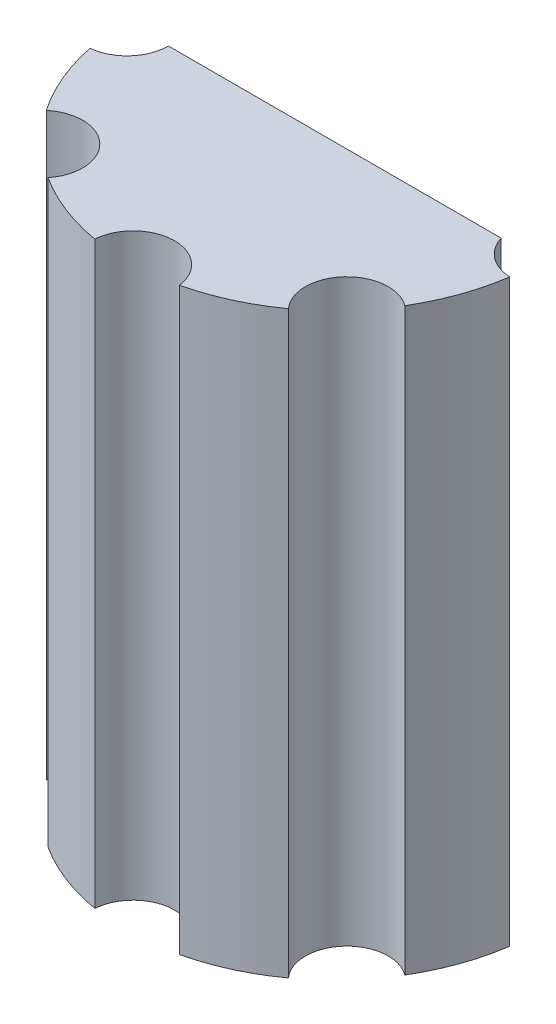
ISO-10303-21;
HEADER;
FILE_DESCRIPTION(('STEP AP214'),'2;1');
FILE_NAME('part.step','',(''),(''),'','','');
FILE_SCHEMA(('AUTOMOTIVE_DESIGN { 1 0 10303 214 1 1 1 1 }'));
ENDSEC;
DATA;
#1=APPLICATION_CONTEXT('core data for automotive mechanical design processes');
#2=APPLICATION_PROTOCOL_DEFINITION('international standard','automotive_design',2000,#1);
#3=PRODUCT_CONTEXT('',#1,'mechanical');
#4=PRODUCT('Part','Part','',(#3));
#5=PRODUCT_RELATED_PRODUCT_CATEGORY('part','',(#4));
#6=PRODUCT_DEFINITION_FORMATION('','',#4);
#7=PRODUCT_DEFINITION_CONTEXT('part definition',#1,'design');
#8=PRODUCT_DEFINITION('design','',#6,#7);
#9=PRODUCT_DEFINITION_SHAPE('','',#8);
#10=(LENGTH_UNIT() NAMED_UNIT(*) SI_UNIT(.MILLI.,.METRE.));
#11=(NAMED_UNIT(*) PLANE_ANGLE_UNIT() SI_UNIT($,.RADIAN.));
#12=(NAMED_UNIT(*) SI_UNIT($,.STERADIAN.) SOLID_ANGLE_UNIT());
#13=UNCERTAINTY_MEASURE_WITH_UNIT(LENGTH_MEASURE(1.E-05),#10,'distance_accuracy_value','');
#14=(GEOMETRIC_REPRESENTATION_CONTEXT(3) GLOBAL_UNCERTAINTY_ASSIGNED_CONTEXT((#13)) GLOBAL_UNIT_ASSIGNED_CONTEXT((#10,
#11,#12)) REPRESENTATION_CONTEXT('',''));
#15=CARTESIAN_POINT('',(0.,0.,0.));
#16=DIRECTION('',(0.,0.,1.));
#17=DIRECTION('',(1.,0.,0.));
#18=AXIS2_PLACEMENT_3D('',#15,#16,#17);
#19=CARTESIAN_POINT('',(0.,7.,0.));
#20=DIRECTION('',(0.,-1.,0.));
#21=DIRECTION('',(0.,0.,-1.));
#22=AXIS2_PLACEMENT_3D('',#19,#20,#21);
#23=CYLINDRICAL_SURFACE('',#22,2.5);
#24=DIRECTION('',(0.,-1.,0.));
#25=VECTOR('',#24,1.);
#26=CARTESIAN_POINT('',(2.4748629703783,3.5,0.353628728824886));
#27=LINE('',#26,#25);
#28=CARTESIAN_POINT('',(2.4748629703783,7.,0.353628728824886));
#29=VERTEX_POINT('',#28);
#30=CARTESIAN_POINT('',(2.4748629703783,0.,0.353628728824886));
#31=VERTEX_POINT('',#30);
#32=EDGE_CURVE('E105',#29,#31,#27,.T.);
#33=ORIENTED_EDGE('',*,*,#32,.F.);
#34=CARTESIAN_POINT('',(0.,7.,0.));
#35=DIRECTION('',(0.,1.,0.));
#36=DIRECTION('',(0.,0.,1.));
#37=AXIS2_PLACEMENT_3D('',#34,#35,#36);
#38=CIRCLE('',#37,2.5);
#39=CARTESIAN_POINT('',(2.1426532925143,7.,1.28803605076785));
#40=VERTEX_POINT('',#39);
#41=EDGE_CURVE('E139',#40,#29,#38,.T.);
#42=ORIENTED_EDGE('',*,*,#41,.F.);
#43=DIRECTION('',(0.,-1.,0.));
#44=VECTOR('',#43,1.);
#45=CARTESIAN_POINT('',(2.1426532925143,3.5,1.28803605076785));
#46=LINE('',#45,#44);
#47=CARTESIAN_POINT('',(2.1426532925143,0.,1.28803605076785));
#48=VERTEX_POINT('',#47);
#49=EDGE_CURVE('E124',#48,#40,#46,.F.);
#50=ORIENTED_EDGE('',*,*,#49,.F.);
#51=CARTESIAN_POINT('',(0.,0.,0.));
#52=DIRECTION('',(0.,1.,0.));
#53=DIRECTION('',(0.,0.,1.));
#54=AXIS2_PLACEMENT_3D('',#51,#52,#53);
#55=CIRCLE('',#54,2.5);
#56=EDGE_CURVE('E119',#48,#31,#55,.T.);
#57=ORIENTED_EDGE('',*,*,#56,.T.);
#58=EDGE_LOOP('',(#33,#42,#50,#57));
#59=FACE_BOUND('',#58,.T.);
#60=ADVANCED_FACE('F31',(#59),#23,.T.);
#61=CARTESIAN_POINT('',(0.,7.,0.));
#62=DIRECTION('',(0.,1.,0.));
#63=DIRECTION('',(0.,0.,1.));
#64=AXIS2_PLACEMENT_3D('',#61,#62,#63);
#65=PLANE('',#64);
#66=ORIENTED_EDGE('',*,*,#41,.T.);
#67=CARTESIAN_POINT('',(2.49573693948688,7.,-0.145935358568967));
#68=DIRECTION('',(0.,1.,0.));
#69=DIRECTION('',(0.,0.,1.));
#70=AXIS2_PLACEMENT_3D('',#67,#68,#69);
#71=CIRCLE('',#70,0.499999999999999);
#72=CARTESIAN_POINT('',(2.01750804960323,7.,0.));
#73=VERTEX_POINT('',#72);
#74=EDGE_CURVE('E108',#73,#29,#71,.T.);
#75=ORIENTED_EDGE('',*,*,#74,.F.);
#76=DIRECTION('',(-1.,0.,0.));
#77=VECTOR('',#76,1.);
#78=CARTESIAN_POINT('',(-2.5,7.,0.));
#79=LINE('',#78,#77);
#80=CARTESIAN_POINT('',(-2.,7.,0.));
#81=VERTEX_POINT('',#80);
#82=EDGE_CURVE('E39',#73,#81,#79,.T.);
#83=ORIENTED_EDGE('',*,*,#82,.T.);
#84=CARTESIAN_POINT('',(-2.5,7.,0.));
#85=DIRECTION('',(0.,1.,0.));
#86=DIRECTION('',(0.,0.,1.));
#87=AXIS2_PLACEMENT_3D('',#84,#85,#86);
#88=CIRCLE('',#87,0.499999999999999);
#89=CARTESIAN_POINT('',(-2.45,7.,0.497493718553309));
#90=VERTEX_POINT('',#89);
#91=EDGE_CURVE('E172',#90,#81,#88,.T.);
#92=ORIENTED_EDGE('',*,*,#91,.F.);
#93=CARTESIAN_POINT('',(-2.06381158708902,7.,1.41091521112967));
#94=VERTEX_POINT('',#93);
#95=EDGE_CURVE('E178',#90,#94,#38,.T.);
#96=ORIENTED_EDGE('',*,*,#95,.T.);
#97=CARTESIAN_POINT('',(-1.74176677336791,7.,1.79339022724881));
#98=DIRECTION('',(0.,1.,0.));
#99=DIRECTION('',(0.,0.,1.));
#100=AXIS2_PLACEMENT_3D('',#97,#98,#99);
#101=CIRCLE('',#100,0.5);
#102=CARTESIAN_POINT('',(-1.35005128871208,7.,2.10412963427799));
#103=VERTEX_POINT('',#102);
#104=EDGE_CURVE('E165',#103,#94,#101,.T.);
#105=ORIENTED_EDGE('',*,*,#104,.F.);
#106=CARTESIAN_POINT('',(-0.425742759106683,7.,2.46348190638134));
#107=VERTEX_POINT('',#106);
#108=EDGE_CURVE('E180',#103,#107,#38,.T.);
#109=ORIENTED_EDGE('',*,*,#108,.T.);
#110=CARTESIAN_POINT('',(0.0729988057532304,7.,2.49893400760376));
#111=DIRECTION('',(0.,1.,0.));
#112=DIRECTION('',(0.,0.,1.));
#113=AXIS2_PLACEMENT_3D('',#110,#111,#112);
#114=CIRCLE('',#113,0.5);
#115=CARTESIAN_POINT('',(0.568820418383014,7.,2.43442874852204));
#116=VERTEX_POINT('',#115);
#117=EDGE_CURVE('E157',#116,#107,#114,.T.);
#118=ORIENTED_EDGE('',*,*,#117,.F.);
#119=CARTESIAN_POINT('',(1.47057591363782,7.,2.02173353393277));
#120=VERTEX_POINT('',#119);
#121=EDGE_CURVE('E214',#116,#120,#38,.T.);
#122=ORIENTED_EDGE('',*,*,#121,.T.);
#123=CARTESIAN_POINT('',(1.84348428885312,7.,1.68865795137787));
#124=DIRECTION('',(0.,1.,0.));
#125=DIRECTION('',(0.,0.,1.));
#126=AXIS2_PLACEMENT_3D('',#123,#124,#125);
#127=CIRCLE('',#126,0.499999999999999);
#128=EDGE_CURVE('E218',#40,#120,#127,.T.);
#129=ORIENTED_EDGE('',*,*,#128,.F.);
#130=EDGE_LOOP('',(#66,#75,#83,#92,#96,#105,#109,#118,#122,#129));
#131=FACE_BOUND('',#130,.T.);
#132=ADVANCED_FACE('F184',(#131),#65,.T.);
#133=CARTESIAN_POINT('',(0.,0.,0.));
#134=DIRECTION('',(0.,1.,0.));
#135=DIRECTION('',(0.,0.,1.));
#136=AXIS2_PLACEMENT_3D('',#133,#134,#135);
#137=PLANE('',#136);
#138=CARTESIAN_POINT('',(2.49573693948688,0.,-0.145935358568967));
#139=DIRECTION('',(0.,1.,0.));
#140=DIRECTION('',(0.,0.,1.));
#141=AXIS2_PLACEMENT_3D('',#138,#139,#140);
#142=CIRCLE('',#141,0.499999999999999);
#143=CARTESIAN_POINT('',(2.01750804960323,0.,0.));
#144=VERTEX_POINT('',#143);
#145=EDGE_CURVE('E45',#144,#31,#142,.T.);
#146=ORIENTED_EDGE('',*,*,#145,.T.);
#147=ORIENTED_EDGE('',*,*,#56,.F.);
#148=CARTESIAN_POINT('',(1.84348428885312,0.,1.68865795137787));
#149=DIRECTION('',(0.,1.,0.));
#150=DIRECTION('',(0.,0.,1.));
#151=AXIS2_PLACEMENT_3D('',#148,#149,#150);
#152=CIRCLE('',#151,0.499999999999999);
#153=CARTESIAN_POINT('',(1.47057591363782,0.,2.02173353393277));
#154=VERTEX_POINT('',#153);
#155=EDGE_CURVE('E113',#48,#154,#152,.T.);
#156=ORIENTED_EDGE('',*,*,#155,.T.);
#157=CARTESIAN_POINT('',(0.568820418383014,0.,2.43442874852204));
#158=VERTEX_POINT('',#157);
#159=EDGE_CURVE('E125',#158,#154,#55,.T.);
#160=ORIENTED_EDGE('',*,*,#159,.F.);
#161=CARTESIAN_POINT('',(0.0729988057532304,0.,2.49893400760376));
#162=DIRECTION('',(0.,1.,0.));
#163=DIRECTION('',(0.,0.,1.));
#164=AXIS2_PLACEMENT_3D('',#161,#162,#163);
#165=CIRCLE('',#164,0.5);
#166=CARTESIAN_POINT('',(-0.425742759106683,0.,2.46348190638134));
#167=VERTEX_POINT('',#166);
#168=EDGE_CURVE('E154',#158,#167,#165,.T.);
#169=ORIENTED_EDGE('',*,*,#168,.T.);
#170=CARTESIAN_POINT('',(-1.35005128871208,0.,2.10412963427799));
#171=VERTEX_POINT('',#170);
#172=EDGE_CURVE('E130',#171,#167,#55,.T.);
#173=ORIENTED_EDGE('',*,*,#172,.F.);
#174=CARTESIAN_POINT('',(-1.74176677336791,0.,1.79339022724881));
#175=DIRECTION('',(0.,1.,0.));
#176=DIRECTION('',(0.,0.,1.));
#177=AXIS2_PLACEMENT_3D('',#174,#175,#176);
#178=CIRCLE('',#177,0.5);
#179=CARTESIAN_POINT('',(-2.06381158708902,0.,1.41091521112967));
#180=VERTEX_POINT('',#179);
#181=EDGE_CURVE('E152',#171,#180,#178,.T.);
#182=ORIENTED_EDGE('',*,*,#181,.T.);
#183=CARTESIAN_POINT('',(-2.45,0.,0.497493718553309));
#184=VERTEX_POINT('',#183);
#185=EDGE_CURVE('E128',#184,#180,#55,.T.);
#186=ORIENTED_EDGE('',*,*,#185,.F.);
#187=CARTESIAN_POINT('',(-2.5,0.,0.));
#188=DIRECTION('',(0.,1.,0.));
#189=DIRECTION('',(0.,0.,1.));
#190=AXIS2_PLACEMENT_3D('',#187,#188,#189);
#191=CIRCLE('',#190,0.499999999999999);
#192=CARTESIAN_POINT('',(-2.,0.,0.));
#193=VERTEX_POINT('',#192);
#194=EDGE_CURVE('E171',#184,#193,#191,.T.);
#195=ORIENTED_EDGE('',*,*,#194,.T.);
#196=DIRECTION('',(-1.,0.,0.));
#197=VECTOR('',#196,1.);
#198=CARTESIAN_POINT('',(-2.5,0.,0.));
#199=LINE('',#198,#197);
#200=EDGE_CURVE('E121',#144,#193,#199,.T.);
#201=ORIENTED_EDGE('',*,*,#200,.F.);
#202=EDGE_LOOP('',(#146,#147,#156,#160,#169,#173,#182,#186,#195,#201));
#203=FACE_BOUND('',#202,.T.);
#204=ADVANCED_FACE('F118',(#203),#137,.F.);
#205=CARTESIAN_POINT('',(-2.5,7.,0.));
#206=DIRECTION('',(0.,0.,1.));
#207=DIRECTION('',(1.,0.,0.));
#208=AXIS2_PLACEMENT_3D('',#205,#206,#207);
#209=PLANE('',#208);
#210=DIRECTION('',(0.,-1.,0.));
#211=VECTOR('',#210,1.);
#212=CARTESIAN_POINT('',(2.01750804960323,7.,0.));
#213=LINE('',#212,#211);
#214=EDGE_CURVE('E11',#144,#73,#213,.F.);
#215=ORIENTED_EDGE('',*,*,#214,.F.);
#216=ORIENTED_EDGE('',*,*,#200,.T.);
#217=DIRECTION('',(0.,-1.,0.));
#218=VECTOR('',#217,1.);
#219=CARTESIAN_POINT('',(-2.,7.,0.));
#220=LINE('',#219,#218);
#221=EDGE_CURVE('E131',#81,#193,#220,.T.);
#222=ORIENTED_EDGE('',*,*,#221,.F.);
#223=ORIENTED_EDGE('',*,*,#82,.F.);
#224=EDGE_LOOP('',(#215,#216,#222,#223));
#225=FACE_BOUND('',#224,.T.);
#226=ADVANCED_FACE('F190',(#225),#209,.F.);
#227=DIRECTION('',(0.,-1.,0.));
#228=VECTOR('',#227,1.);
#229=CARTESIAN_POINT('',(1.47057591363782,3.5,2.02173353393277));
#230=LINE('',#229,#228);
#231=EDGE_CURVE('E53',#120,#154,#230,.T.);
#232=ORIENTED_EDGE('',*,*,#231,.F.);
#233=ORIENTED_EDGE('',*,*,#121,.F.);
#234=DIRECTION('',(0.,-1.,0.));
#235=VECTOR('',#234,1.);
#236=CARTESIAN_POINT('',(0.568820418383014,3.5,2.43442874852204));
#237=LINE('',#236,#235);
#238=EDGE_CURVE('E159',#158,#116,#237,.F.);
#239=ORIENTED_EDGE('',*,*,#238,.F.);
#240=ORIENTED_EDGE('',*,*,#159,.T.);
#241=EDGE_LOOP('',(#232,#233,#239,#240));
#242=FACE_BOUND('',#241,.T.);
#243=ADVANCED_FACE('F192',(#242),#23,.T.);
#244=DIRECTION('',(0.,-1.,0.));
#245=VECTOR('',#244,1.);
#246=CARTESIAN_POINT('',(-0.425742759106683,3.5,2.46348190638134));
#247=LINE('',#246,#245);
#248=EDGE_CURVE('E147',#107,#167,#247,.T.);
#249=ORIENTED_EDGE('',*,*,#248,.F.);
#250=ORIENTED_EDGE('',*,*,#108,.F.);
#251=DIRECTION('',(0.,-1.,0.));
#252=VECTOR('',#251,1.);
#253=CARTESIAN_POINT('',(-1.35005128871208,3.5,2.10412963427799));
#254=LINE('',#253,#252);
#255=EDGE_CURVE('E149',#171,#103,#254,.F.);
#256=ORIENTED_EDGE('',*,*,#255,.F.);
#257=ORIENTED_EDGE('',*,*,#172,.T.);
#258=EDGE_LOOP('',(#249,#250,#256,#257));
#259=FACE_BOUND('',#258,.T.);
#260=ADVANCED_FACE('F145',(#259),#23,.T.);
#261=DIRECTION('',(0.,-1.,0.));
#262=VECTOR('',#261,1.);
#263=CARTESIAN_POINT('',(-2.06381158708902,3.5,1.41091521112967));
#264=LINE('',#263,#262);
#265=EDGE_CURVE('E169',#94,#180,#264,.T.);
#266=ORIENTED_EDGE('',*,*,#265,.F.);
#267=ORIENTED_EDGE('',*,*,#95,.F.);
#268=DIRECTION('',(0.,-1.,0.));
#269=VECTOR('',#268,1.);
#270=CARTESIAN_POINT('',(-2.45,3.5,0.497493718553309));
#271=LINE('',#270,#269);
#272=EDGE_CURVE('E126',#184,#90,#271,.F.);
#273=ORIENTED_EDGE('',*,*,#272,.F.);
#274=ORIENTED_EDGE('',*,*,#185,.T.);
#275=EDGE_LOOP('',(#266,#267,#273,#274));
#276=FACE_BOUND('',#275,.T.);
#277=ADVANCED_FACE('F33',(#276),#23,.T.);
#278=CARTESIAN_POINT('',(-2.5,7.,0.));
#279=DIRECTION('',(0.,-1.,0.));
#280=DIRECTION('',(0.,0.,-1.));
#281=AXIS2_PLACEMENT_3D('',#278,#279,#280);
#282=CYLINDRICAL_SURFACE('',#281,0.499999999999999);
#283=ORIENTED_EDGE('',*,*,#272,.T.);
#284=ORIENTED_EDGE('',*,*,#91,.T.);
#285=ORIENTED_EDGE('',*,*,#221,.T.);
#286=ORIENTED_EDGE('',*,*,#194,.F.);
#287=EDGE_LOOP('',(#283,#284,#285,#286));
#288=FACE_BOUND('',#287,.T.);
#289=ADVANCED_FACE('F189',(#288),#282,.F.);
#290=CARTESIAN_POINT('',(-1.74176677336791,7.,1.79339022724881));
#291=DIRECTION('',(0.,-1.,0.));
#292=DIRECTION('',(0.,0.,-1.));
#293=AXIS2_PLACEMENT_3D('',#290,#291,#292);
#294=CYLINDRICAL_SURFACE('',#293,0.5);
#295=ORIENTED_EDGE('',*,*,#265,.T.);
#296=ORIENTED_EDGE('',*,*,#181,.F.);
#297=ORIENTED_EDGE('',*,*,#255,.T.);
#298=ORIENTED_EDGE('',*,*,#104,.T.);
#299=EDGE_LOOP('',(#295,#296,#297,#298));
#300=FACE_BOUND('',#299,.T.);
#301=ADVANCED_FACE('F209',(#300),#294,.F.);
#302=CARTESIAN_POINT('',(0.0729988057532304,7.,2.49893400760376));
#303=DIRECTION('',(0.,-1.,0.));
#304=DIRECTION('',(0.,0.,-1.));
#305=AXIS2_PLACEMENT_3D('',#302,#303,#304);
#306=CYLINDRICAL_SURFACE('',#305,0.5);
#307=ORIENTED_EDGE('',*,*,#248,.T.);
#308=ORIENTED_EDGE('',*,*,#168,.F.);
#309=ORIENTED_EDGE('',*,*,#238,.T.);
#310=ORIENTED_EDGE('',*,*,#117,.T.);
#311=EDGE_LOOP('',(#307,#308,#309,#310));
#312=FACE_BOUND('',#311,.T.);
#313=ADVANCED_FACE('F223',(#312),#306,.F.);
#314=CARTESIAN_POINT('',(1.84348428885312,7.,1.68865795137787));
#315=DIRECTION('',(0.,-1.,0.));
#316=DIRECTION('',(0.,0.,-1.));
#317=AXIS2_PLACEMENT_3D('',#314,#315,#316);
#318=CYLINDRICAL_SURFACE('',#317,0.499999999999999);
#319=ORIENTED_EDGE('',*,*,#231,.T.);
#320=ORIENTED_EDGE('',*,*,#155,.F.);
#321=ORIENTED_EDGE('',*,*,#49,.T.);
#322=ORIENTED_EDGE('',*,*,#128,.T.);
#323=EDGE_LOOP('',(#319,#320,#321,#322));
#324=FACE_BOUND('',#323,.T.);
#325=ADVANCED_FACE('F225',(#324),#318,.F.);
#326=CARTESIAN_POINT('',(2.49573693948688,7.,-0.145935358568967));
#327=DIRECTION('',(0.,-1.,0.));
#328=DIRECTION('',(0.,0.,-1.));
#329=AXIS2_PLACEMENT_3D('',#326,#327,#328);
#330=CYLINDRICAL_SURFACE('',#329,0.499999999999999);
#331=ORIENTED_EDGE('',*,*,#32,.T.);
#332=ORIENTED_EDGE('',*,*,#145,.F.);
#333=ORIENTED_EDGE('',*,*,#214,.T.);
#334=ORIENTED_EDGE('',*,*,#74,.T.);
#335=EDGE_LOOP('',(#331,#332,#333,#334));
#336=FACE_BOUND('',#335,.T.);
#337=ADVANCED_FACE('F106',(#336),#330,.F.);
#338=CLOSED_SHELL('',(#60,#132,#204,#226,#243,#260,#277,#289,#301,#313,#325,#337));
#339=MANIFOLD_SOLID_BREP('B2',#338);
#340=ADVANCED_BREP_SHAPE_REPRESENTATION('',(#18,#339),#14);
#341=SHAPE_DEFINITION_REPRESENTATION(#9,#340);
ENDSEC;
END-ISO-10303-21;
